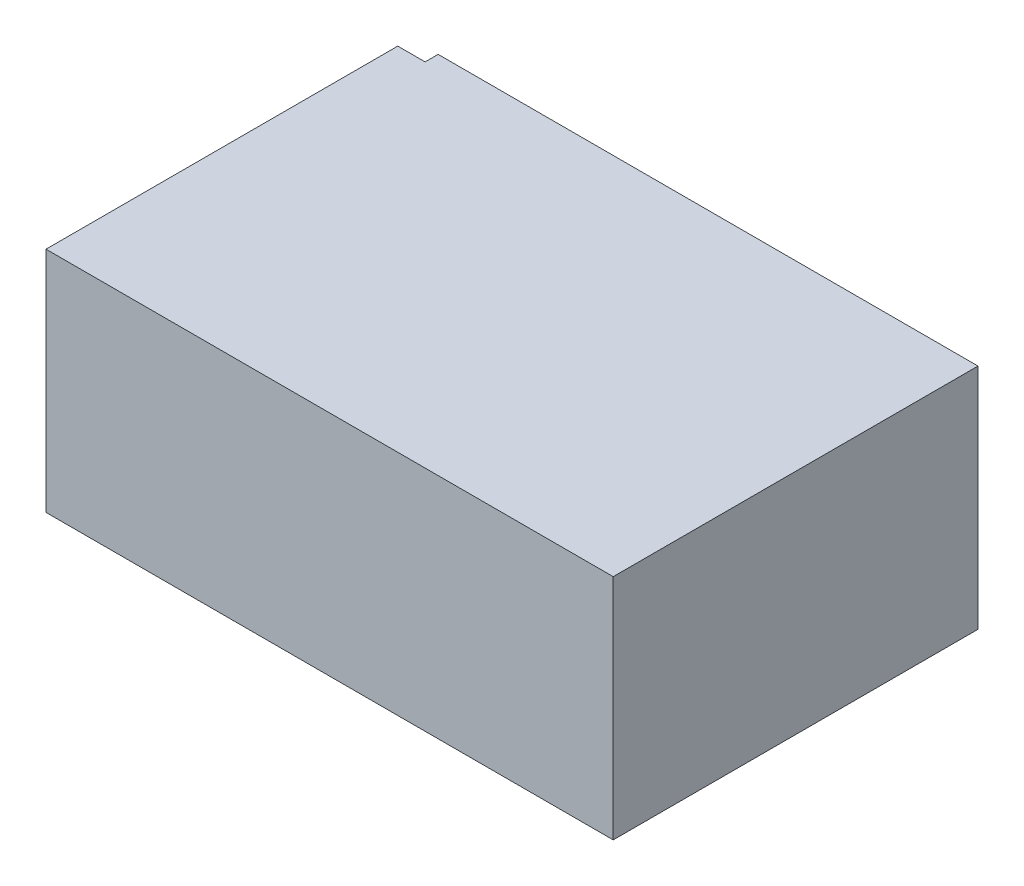
ISO-10303-21;
HEADER;
FILE_DESCRIPTION(('STEP AP214'),'2;1');
FILE_NAME('part.step','',(''),(''),'','','');
FILE_SCHEMA(('AUTOMOTIVE_DESIGN { 1 0 10303 214 1 1 1 1 }'));
ENDSEC;
DATA;
#1=APPLICATION_CONTEXT('core data for automotive mechanical design processes');
#2=APPLICATION_PROTOCOL_DEFINITION('international standard','automotive_design',2000,#1);
#3=PRODUCT_CONTEXT('',#1,'mechanical');
#4=PRODUCT('Part','Part','',(#3));
#5=PRODUCT_RELATED_PRODUCT_CATEGORY('part','',(#4));
#6=PRODUCT_DEFINITION_FORMATION('','',#4);
#7=PRODUCT_DEFINITION_CONTEXT('part definition',#1,'design');
#8=PRODUCT_DEFINITION('design','',#6,#7);
#9=PRODUCT_DEFINITION_SHAPE('','',#8);
#10=(LENGTH_UNIT() NAMED_UNIT(*) SI_UNIT(.MILLI.,.METRE.));
#11=(NAMED_UNIT(*) PLANE_ANGLE_UNIT() SI_UNIT($,.RADIAN.));
#12=(NAMED_UNIT(*) SI_UNIT($,.STERADIAN.) SOLID_ANGLE_UNIT());
#13=UNCERTAINTY_MEASURE_WITH_UNIT(LENGTH_MEASURE(1.E-05),#10,'distance_accuracy_value','');
#14=(GEOMETRIC_REPRESENTATION_CONTEXT(3) GLOBAL_UNCERTAINTY_ASSIGNED_CONTEXT((#13)) GLOBAL_UNIT_ASSIGNED_CONTEXT((#10,
#11,#12)) REPRESENTATION_CONTEXT('',''));
#15=CARTESIAN_POINT('',(0.,0.,0.));
#16=DIRECTION('',(0.,0.,1.));
#17=DIRECTION('',(1.,0.,0.));
#18=AXIS2_PLACEMENT_3D('',#15,#16,#17);
#19=CARTESIAN_POINT('',(-87.075,70.,-56.));
#20=DIRECTION('',(0.,0.,1.));
#21=DIRECTION('',(1.,0.,0.));
#22=AXIS2_PLACEMENT_3D('',#19,#20,#21);
#23=PLANE('',#22);
#24=DIRECTION('',(1.,0.,0.));
#25=VECTOR('',#24,1.);
#26=CARTESIAN_POINT('',(0.,52.5,-56.));
#27=LINE('',#26,#25);
#28=CARTESIAN_POINT('',(-87.075,52.5,-56.));
#29=VERTEX_POINT('',#28);
#30=CARTESIAN_POINT('',(-78.6753185575466,52.5,-56.));
#31=VERTEX_POINT('',#30);
#32=EDGE_CURVE('E120',#29,#31,#27,.T.);
#33=ORIENTED_EDGE('',*,*,#32,.T.);
#34=DIRECTION('',(0.,-1.,0.));
#35=VECTOR('',#34,1.);
#36=CARTESIAN_POINT('',(-78.6753185575466,0.,-56.));
#37=LINE('',#36,#35);
#38=CARTESIAN_POINT('',(-78.6753185575466,70.,-56.));
#39=VERTEX_POINT('',#38);
#40=EDGE_CURVE('E130',#39,#31,#37,.T.);
#41=ORIENTED_EDGE('',*,*,#40,.F.);
#42=DIRECTION('',(-1.,0.,0.));
#43=VECTOR('',#42,1.);
#44=CARTESIAN_POINT('',(-87.075,70.,-56.));
#45=LINE('',#44,#43);
#46=CARTESIAN_POINT('',(87.075,70.,-56.));
#47=VERTEX_POINT('',#46);
#48=EDGE_CURVE('E171',#47,#39,#45,.T.);
#49=ORIENTED_EDGE('',*,*,#48,.F.);
#50=DIRECTION('',(0.,-1.,0.));
#51=VECTOR('',#50,1.);
#52=CARTESIAN_POINT('',(87.075,70.,-56.));
#53=LINE('',#52,#51);
#54=CARTESIAN_POINT('',(87.075,0.,-56.));
#55=VERTEX_POINT('',#54);
#56=EDGE_CURVE('E11',#47,#55,#53,.T.);
#57=ORIENTED_EDGE('',*,*,#56,.T.);
#58=DIRECTION('',(-1.,0.,0.));
#59=VECTOR('',#58,1.);
#60=CARTESIAN_POINT('',(-87.075,0.,-56.));
#61=LINE('',#60,#59);
#62=CARTESIAN_POINT('',(-78.6753185575466,0.,-56.));
#63=VERTEX_POINT('',#62);
#64=EDGE_CURVE('E181',#55,#63,#61,.T.);
#65=ORIENTED_EDGE('',*,*,#64,.T.);
#66=DIRECTION('',(0.,-1.,0.));
#67=VECTOR('',#66,1.);
#68=CARTESIAN_POINT('',(-78.6753185575466,0.,-56.));
#69=LINE('',#68,#67);
#70=CARTESIAN_POINT('',(-78.6753185575466,17.5,-56.));
#71=VERTEX_POINT('',#70);
#72=EDGE_CURVE('E153',#71,#63,#69,.T.);
#73=ORIENTED_EDGE('',*,*,#72,.F.);
#74=DIRECTION('',(1.,0.,0.));
#75=VECTOR('',#74,1.);
#76=CARTESIAN_POINT('',(0.,17.5,-56.));
#77=LINE('',#76,#75);
#78=CARTESIAN_POINT('',(-87.075,17.5,-56.));
#79=VERTEX_POINT('',#78);
#80=EDGE_CURVE('E159',#79,#71,#77,.T.);
#81=ORIENTED_EDGE('',*,*,#80,.F.);
#82=DIRECTION('',(0.,-1.,0.));
#83=VECTOR('',#82,1.);
#84=CARTESIAN_POINT('',(-87.075,70.,-56.));
#85=LINE('',#84,#83);
#86=EDGE_CURVE('E45',#29,#79,#85,.T.);
#87=ORIENTED_EDGE('',*,*,#86,.F.);
#88=EDGE_LOOP('',(#33,#41,#49,#57,#65,#73,#81,#87));
#89=FACE_BOUND('',#88,.T.);
#90=ADVANCED_FACE('F37',(#89),#23,.F.);
#91=CARTESIAN_POINT('',(-87.075,70.,-56.));
#92=DIRECTION('',(1.,0.,0.));
#93=DIRECTION('',(0.,0.,-1.));
#94=AXIS2_PLACEMENT_3D('',#91,#92,#93);
#95=PLANE('',#94);
#96=DIRECTION('',(0.,0.,-1.));
#97=VECTOR('',#96,1.);
#98=CARTESIAN_POINT('',(-87.075,52.5,-52.));
#99=LINE('',#98,#97);
#100=CARTESIAN_POINT('',(-87.075,52.5,-52.));
#101=VERTEX_POINT('',#100);
#102=EDGE_CURVE('E115',#101,#29,#99,.T.);
#103=ORIENTED_EDGE('',*,*,#102,.T.);
#104=ORIENTED_EDGE('',*,*,#86,.T.);
#105=DIRECTION('',(0.,0.,-1.));
#106=VECTOR('',#105,1.);
#107=CARTESIAN_POINT('',(-87.075,17.5,-52.));
#108=LINE('',#107,#106);
#109=CARTESIAN_POINT('',(-87.075,17.5,-52.));
#110=VERTEX_POINT('',#109);
#111=EDGE_CURVE('E158',#110,#79,#108,.T.);
#112=ORIENTED_EDGE('',*,*,#111,.F.);
#113=DIRECTION('',(0.,1.,0.));
#114=VECTOR('',#113,1.);
#115=CARTESIAN_POINT('',(-87.075,0.,-52.));
#116=LINE('',#115,#114);
#117=CARTESIAN_POINT('',(-87.075,0.,-52.));
#118=VERTEX_POINT('',#117);
#119=EDGE_CURVE('E149',#118,#110,#116,.T.);
#120=ORIENTED_EDGE('',*,*,#119,.F.);
#121=DIRECTION('',(0.,0.,1.));
#122=VECTOR('',#121,1.);
#123=CARTESIAN_POINT('',(-87.075,0.,-56.));
#124=LINE('',#123,#122);
#125=CARTESIAN_POINT('',(-87.075,0.,56.));
#126=VERTEX_POINT('',#125);
#127=EDGE_CURVE('E184',#118,#126,#124,.T.);
#128=ORIENTED_EDGE('',*,*,#127,.T.);
#129=DIRECTION('',(0.,-1.,0.));
#130=VECTOR('',#129,1.);
#131=CARTESIAN_POINT('',(-87.075,70.,56.));
#132=LINE('',#131,#130);
#133=CARTESIAN_POINT('',(-87.075,70.,56.));
#134=VERTEX_POINT('',#133);
#135=EDGE_CURVE('E189',#134,#126,#132,.T.);
#136=ORIENTED_EDGE('',*,*,#135,.F.);
#137=DIRECTION('',(0.,0.,1.));
#138=VECTOR('',#137,1.);
#139=CARTESIAN_POINT('',(-87.075,70.,-56.));
#140=LINE('',#139,#138);
#141=CARTESIAN_POINT('',(-87.075,70.,-52.));
#142=VERTEX_POINT('',#141);
#143=EDGE_CURVE('E135',#142,#134,#140,.T.);
#144=ORIENTED_EDGE('',*,*,#143,.F.);
#145=DIRECTION('',(0.,1.,0.));
#146=VECTOR('',#145,1.);
#147=CARTESIAN_POINT('',(-87.075,0.,-52.));
#148=LINE('',#147,#146);
#149=EDGE_CURVE('E52',#101,#142,#148,.T.);
#150=ORIENTED_EDGE('',*,*,#149,.F.);
#151=EDGE_LOOP('',(#103,#104,#112,#120,#128,#136,#144,#150));
#152=FACE_BOUND('',#151,.T.);
#153=ADVANCED_FACE('F133',(#152),#95,.F.);
#154=CARTESIAN_POINT('',(87.075,70.,-56.));
#155=DIRECTION('',(-1.,0.,0.));
#156=DIRECTION('',(0.,0.,1.));
#157=AXIS2_PLACEMENT_3D('',#154,#155,#156);
#158=PLANE('',#157);
#159=DIRECTION('',(0.,0.,-1.));
#160=VECTOR('',#159,1.);
#161=CARTESIAN_POINT('',(87.075,0.,-56.));
#162=LINE('',#161,#160);
#163=CARTESIAN_POINT('',(87.075,0.,56.));
#164=VERTEX_POINT('',#163);
#165=EDGE_CURVE('E147',#164,#55,#162,.T.);
#166=ORIENTED_EDGE('',*,*,#165,.T.);
#167=ORIENTED_EDGE('',*,*,#56,.F.);
#168=DIRECTION('',(0.,0.,-1.));
#169=VECTOR('',#168,1.);
#170=CARTESIAN_POINT('',(87.075,70.,-56.));
#171=LINE('',#170,#169);
#172=CARTESIAN_POINT('',(87.075,70.,56.));
#173=VERTEX_POINT('',#172);
#174=EDGE_CURVE('E168',#173,#47,#171,.T.);
#175=ORIENTED_EDGE('',*,*,#174,.F.);
#176=DIRECTION('',(0.,-1.,0.));
#177=VECTOR('',#176,1.);
#178=CARTESIAN_POINT('',(87.075,70.,56.));
#179=LINE('',#178,#177);
#180=EDGE_CURVE('E178',#173,#164,#179,.T.);
#181=ORIENTED_EDGE('',*,*,#180,.T.);
#182=EDGE_LOOP('',(#166,#167,#175,#181));
#183=FACE_BOUND('',#182,.T.);
#184=ADVANCED_FACE('F39',(#183),#158,.F.);
#185=CARTESIAN_POINT('',(-87.075,70.,56.));
#186=DIRECTION('',(0.,0.,-1.));
#187=DIRECTION('',(-1.,0.,0.));
#188=AXIS2_PLACEMENT_3D('',#185,#186,#187);
#189=PLANE('',#188);
#190=DIRECTION('',(1.,0.,0.));
#191=VECTOR('',#190,1.);
#192=CARTESIAN_POINT('',(-87.075,0.,56.));
#193=LINE('',#192,#191);
#194=EDGE_CURVE('E172',#126,#164,#193,.T.);
#195=ORIENTED_EDGE('',*,*,#194,.T.);
#196=ORIENTED_EDGE('',*,*,#180,.F.);
#197=DIRECTION('',(1.,0.,0.));
#198=VECTOR('',#197,1.);
#199=CARTESIAN_POINT('',(-87.075,70.,56.));
#200=LINE('',#199,#198);
#201=EDGE_CURVE('E176',#134,#173,#200,.T.);
#202=ORIENTED_EDGE('',*,*,#201,.F.);
#203=ORIENTED_EDGE('',*,*,#135,.T.);
#204=EDGE_LOOP('',(#195,#196,#202,#203));
#205=FACE_BOUND('',#204,.T.);
#206=ADVANCED_FACE('F208',(#205),#189,.F.);
#207=CARTESIAN_POINT('',(0.,70.,0.));
#208=DIRECTION('',(0.,1.,0.));
#209=DIRECTION('',(0.,0.,1.));
#210=AXIS2_PLACEMENT_3D('',#207,#208,#209);
#211=PLANE('',#210);
#212=DIRECTION('',(0.,0.,-1.));
#213=VECTOR('',#212,1.);
#214=CARTESIAN_POINT('',(-78.6753185575466,70.,-52.));
#215=LINE('',#214,#213);
#216=CARTESIAN_POINT('',(-78.6753185575466,70.,-52.));
#217=VERTEX_POINT('',#216);
#218=EDGE_CURVE('E124',#217,#39,#215,.T.);
#219=ORIENTED_EDGE('',*,*,#218,.F.);
#220=DIRECTION('',(1.,0.,0.));
#221=VECTOR('',#220,1.);
#222=CARTESIAN_POINT('',(0.,70.,-52.));
#223=LINE('',#222,#221);
#224=EDGE_CURVE('E136',#142,#217,#223,.T.);
#225=ORIENTED_EDGE('',*,*,#224,.F.);
#226=ORIENTED_EDGE('',*,*,#143,.T.);
#227=ORIENTED_EDGE('',*,*,#201,.T.);
#228=ORIENTED_EDGE('',*,*,#174,.T.);
#229=ORIENTED_EDGE('',*,*,#48,.T.);
#230=EDGE_LOOP('',(#219,#225,#226,#227,#228,#229));
#231=FACE_BOUND('',#230,.T.);
#232=ADVANCED_FACE('F215',(#231),#211,.T.);
#233=CARTESIAN_POINT('',(0.,0.,0.));
#234=DIRECTION('',(0.,1.,0.));
#235=DIRECTION('',(0.,0.,1.));
#236=AXIS2_PLACEMENT_3D('',#233,#234,#235);
#237=PLANE('',#236);
#238=DIRECTION('',(-1.,0.,0.));
#239=VECTOR('',#238,1.);
#240=CARTESIAN_POINT('',(0.,0.,-52.));
#241=LINE('',#240,#239);
#242=CARTESIAN_POINT('',(-78.6753185575466,0.,-52.));
#243=VERTEX_POINT('',#242);
#244=EDGE_CURVE('E156',#243,#118,#241,.T.);
#245=ORIENTED_EDGE('',*,*,#244,.F.);
#246=DIRECTION('',(0.,0.,-1.));
#247=VECTOR('',#246,1.);
#248=CARTESIAN_POINT('',(-78.6753185575466,0.,-52.));
#249=LINE('',#248,#247);
#250=EDGE_CURVE('E142',#243,#63,#249,.T.);
#251=ORIENTED_EDGE('',*,*,#250,.T.);
#252=ORIENTED_EDGE('',*,*,#64,.F.);
#253=ORIENTED_EDGE('',*,*,#165,.F.);
#254=ORIENTED_EDGE('',*,*,#194,.F.);
#255=ORIENTED_EDGE('',*,*,#127,.F.);
#256=EDGE_LOOP('',(#245,#251,#252,#253,#254,#255));
#257=FACE_BOUND('',#256,.T.);
#258=ADVANCED_FACE('F204',(#257),#237,.F.);
#259=CARTESIAN_POINT('',(-78.6753185575466,0.,-52.));
#260=DIRECTION('',(1.,0.,0.));
#261=DIRECTION('',(0.,0.,-1.));
#262=AXIS2_PLACEMENT_3D('',#259,#260,#261);
#263=PLANE('',#262);
#264=ORIENTED_EDGE('',*,*,#72,.T.);
#265=ORIENTED_EDGE('',*,*,#250,.F.);
#266=DIRECTION('',(0.,-1.,0.));
#267=VECTOR('',#266,1.);
#268=CARTESIAN_POINT('',(-78.6753185575466,0.,-52.));
#269=LINE('',#268,#267);
#270=CARTESIAN_POINT('',(-78.6753185575466,17.5,-52.));
#271=VERTEX_POINT('',#270);
#272=EDGE_CURVE('E60',#271,#243,#269,.T.);
#273=ORIENTED_EDGE('',*,*,#272,.F.);
#274=DIRECTION('',(0.,0.,-1.));
#275=VECTOR('',#274,1.);
#276=CARTESIAN_POINT('',(-78.6753185575466,17.5,-52.));
#277=LINE('',#276,#275);
#278=EDGE_CURVE('E165',#271,#71,#277,.T.);
#279=ORIENTED_EDGE('',*,*,#278,.T.);
#280=EDGE_LOOP('',(#264,#265,#273,#279));
#281=FACE_BOUND('',#280,.T.);
#282=ADVANCED_FACE('F219',(#281),#263,.F.);
#283=CARTESIAN_POINT('',(0.,17.5,-52.));
#284=DIRECTION('',(0.,1.,0.));
#285=DIRECTION('',(0.,0.,1.));
#286=AXIS2_PLACEMENT_3D('',#283,#284,#285);
#287=PLANE('',#286);
#288=ORIENTED_EDGE('',*,*,#80,.T.);
#289=ORIENTED_EDGE('',*,*,#278,.F.);
#290=DIRECTION('',(1.,0.,0.));
#291=VECTOR('',#290,1.);
#292=CARTESIAN_POINT('',(0.,17.5,-52.));
#293=LINE('',#292,#291);
#294=EDGE_CURVE('E152',#110,#271,#293,.T.);
#295=ORIENTED_EDGE('',*,*,#294,.F.);
#296=ORIENTED_EDGE('',*,*,#111,.T.);
#297=EDGE_LOOP('',(#288,#289,#295,#296));
#298=FACE_BOUND('',#297,.T.);
#299=ADVANCED_FACE('F198',(#298),#287,.F.);
#300=CARTESIAN_POINT('',(0.,0.,-52.));
#301=DIRECTION('',(0.,0.,-1.));
#302=DIRECTION('',(-1.,0.,0.));
#303=AXIS2_PLACEMENT_3D('',#300,#301,#302);
#304=PLANE('',#303);
#305=ORIENTED_EDGE('',*,*,#119,.T.);
#306=ORIENTED_EDGE('',*,*,#294,.T.);
#307=ORIENTED_EDGE('',*,*,#272,.T.);
#308=ORIENTED_EDGE('',*,*,#244,.T.);
#309=EDGE_LOOP('',(#305,#306,#307,#308));
#310=FACE_BOUND('',#309,.T.);
#311=ADVANCED_FACE('F199',(#310),#304,.T.);
#312=CARTESIAN_POINT('',(0.,52.5,-52.));
#313=DIRECTION('',(0.,1.,0.));
#314=DIRECTION('',(0.,0.,1.));
#315=AXIS2_PLACEMENT_3D('',#312,#313,#314);
#316=PLANE('',#315);
#317=ORIENTED_EDGE('',*,*,#32,.F.);
#318=ORIENTED_EDGE('',*,*,#102,.F.);
#319=DIRECTION('',(1.,0.,0.));
#320=VECTOR('',#319,1.);
#321=CARTESIAN_POINT('',(0.,52.5,-52.));
#322=LINE('',#321,#320);
#323=CARTESIAN_POINT('',(-78.6753185575466,52.5,-52.));
#324=VERTEX_POINT('',#323);
#325=EDGE_CURVE('E117',#101,#324,#322,.T.);
#326=ORIENTED_EDGE('',*,*,#325,.T.);
#327=DIRECTION('',(0.,0.,-1.));
#328=VECTOR('',#327,1.);
#329=CARTESIAN_POINT('',(-78.6753185575466,52.5,-52.));
#330=LINE('',#329,#328);
#331=EDGE_CURVE('E145',#324,#31,#330,.T.);
#332=ORIENTED_EDGE('',*,*,#331,.T.);
#333=EDGE_LOOP('',(#317,#318,#326,#332));
#334=FACE_BOUND('',#333,.T.);
#335=ADVANCED_FACE('F116',(#334),#316,.T.);
#336=CARTESIAN_POINT('',(-78.6753185575466,0.,-52.));
#337=DIRECTION('',(1.,0.,0.));
#338=DIRECTION('',(0.,0.,-1.));
#339=AXIS2_PLACEMENT_3D('',#336,#337,#338);
#340=PLANE('',#339);
#341=ORIENTED_EDGE('',*,*,#40,.T.);
#342=ORIENTED_EDGE('',*,*,#331,.F.);
#343=DIRECTION('',(0.,-1.,0.));
#344=VECTOR('',#343,1.);
#345=CARTESIAN_POINT('',(-78.6753185575466,0.,-52.));
#346=LINE('',#345,#344);
#347=EDGE_CURVE('E125',#217,#324,#346,.T.);
#348=ORIENTED_EDGE('',*,*,#347,.F.);
#349=ORIENTED_EDGE('',*,*,#218,.T.);
#350=EDGE_LOOP('',(#341,#342,#348,#349));
#351=FACE_BOUND('',#350,.T.);
#352=ADVANCED_FACE('F217',(#351),#340,.F.);
#353=CARTESIAN_POINT('',(0.,0.,-52.));
#354=DIRECTION('',(0.,0.,-1.));
#355=DIRECTION('',(-1.,0.,0.));
#356=AXIS2_PLACEMENT_3D('',#353,#354,#355);
#357=PLANE('',#356);
#358=ORIENTED_EDGE('',*,*,#325,.F.);
#359=ORIENTED_EDGE('',*,*,#149,.T.);
#360=ORIENTED_EDGE('',*,*,#224,.T.);
#361=ORIENTED_EDGE('',*,*,#347,.T.);
#362=EDGE_LOOP('',(#358,#359,#360,#361));
#363=FACE_BOUND('',#362,.T.);
#364=ADVANCED_FACE('F128',(#363),#357,.T.);
#365=CLOSED_SHELL('',(#90,#153,#184,#206,#232,#258,#282,#299,#311,#335,#352,#364));
#366=MANIFOLD_SOLID_BREP('B2',#365);
#367=ADVANCED_BREP_SHAPE_REPRESENTATION('',(#18,#366),#14);
#368=SHAPE_DEFINITION_REPRESENTATION(#9,#367);
ENDSEC;
END-ISO-10303-21;
